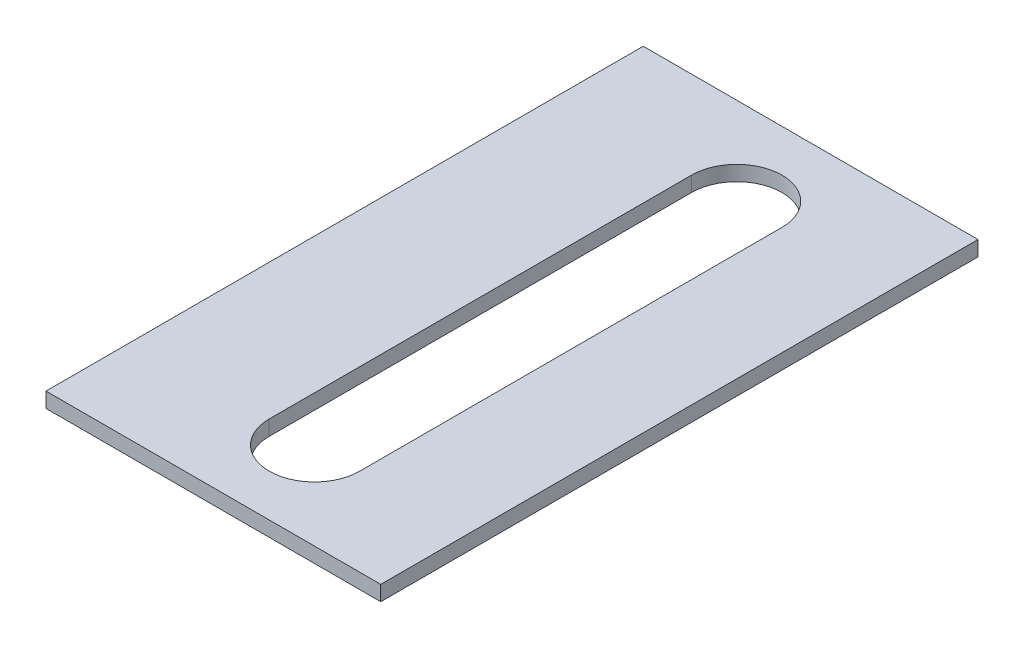
ISO-10303-21;
HEADER;
FILE_DESCRIPTION(('STEP AP214'),'2;1');
FILE_NAME('part.step','',(''),(''),'','','');
FILE_SCHEMA(('AUTOMOTIVE_DESIGN { 1 0 10303 214 1 1 1 1 }'));
ENDSEC;
DATA;
#1=APPLICATION_CONTEXT('core data for automotive mechanical design processes');
#2=APPLICATION_PROTOCOL_DEFINITION('international standard','automotive_design',2000,#1);
#3=PRODUCT_CONTEXT('',#1,'mechanical');
#4=PRODUCT('Part','Part','',(#3));
#5=PRODUCT_RELATED_PRODUCT_CATEGORY('part','',(#4));
#6=PRODUCT_DEFINITION_FORMATION('','',#4);
#7=PRODUCT_DEFINITION_CONTEXT('part definition',#1,'design');
#8=PRODUCT_DEFINITION('design','',#6,#7);
#9=PRODUCT_DEFINITION_SHAPE('','',#8);
#10=(LENGTH_UNIT() NAMED_UNIT(*) SI_UNIT(.MILLI.,.METRE.));
#11=(NAMED_UNIT(*) PLANE_ANGLE_UNIT() SI_UNIT($,.RADIAN.));
#12=(NAMED_UNIT(*) SI_UNIT($,.STERADIAN.) SOLID_ANGLE_UNIT());
#13=UNCERTAINTY_MEASURE_WITH_UNIT(LENGTH_MEASURE(1.E-05),#10,'distance_accuracy_value','');
#14=(GEOMETRIC_REPRESENTATION_CONTEXT(3) GLOBAL_UNCERTAINTY_ASSIGNED_CONTEXT((#13)) GLOBAL_UNIT_ASSIGNED_CONTEXT((#10,
#11,#12)) REPRESENTATION_CONTEXT('',''));
#15=CARTESIAN_POINT('',(0.,0.,0.));
#16=DIRECTION('',(0.,0.,1.));
#17=DIRECTION('',(1.,0.,0.));
#18=AXIS2_PLACEMENT_3D('',#15,#16,#17);
#19=CARTESIAN_POINT('',(-12.,8.4,6.9));
#20=DIRECTION('',(1.,0.,0.));
#21=DIRECTION('',(0.,0.,-1.));
#22=AXIS2_PLACEMENT_3D('',#19,#20,#21);
#23=PLANE('',#22);
#24=DIRECTION('',(0.,1.,0.));
#25=VECTOR('',#24,1.);
#26=CARTESIAN_POINT('',(-12.,8.4,-9.9));
#27=LINE('',#26,#25);
#28=CARTESIAN_POINT('',(-12.,7.9,-9.9));
#29=VERTEX_POINT('',#28);
#30=CARTESIAN_POINT('',(-12.,8.4,-9.9));
#31=VERTEX_POINT('',#30);
#32=EDGE_CURVE('E121',#29,#31,#27,.T.);
#33=ORIENTED_EDGE('',*,*,#32,.F.);
#34=DIRECTION('',(0.,0.,-1.));
#35=VECTOR('',#34,1.);
#36=CARTESIAN_POINT('',(-12.,7.9,-9.9));
#37=LINE('',#36,#35);
#38=CARTESIAN_POINT('',(-12.,7.9,9.9));
#39=VERTEX_POINT('',#38);
#40=EDGE_CURVE('E107',#39,#29,#37,.T.);
#41=ORIENTED_EDGE('',*,*,#40,.F.);
#42=DIRECTION('',(0.,-1.,0.));
#43=VECTOR('',#42,1.);
#44=CARTESIAN_POINT('',(-12.,8.4,9.9));
#45=LINE('',#44,#43);
#46=CARTESIAN_POINT('',(-12.,8.4,9.9));
#47=VERTEX_POINT('',#46);
#48=EDGE_CURVE('E137',#47,#39,#45,.T.);
#49=ORIENTED_EDGE('',*,*,#48,.F.);
#50=DIRECTION('',(0.,0.,1.));
#51=VECTOR('',#50,1.);
#52=CARTESIAN_POINT('',(-12.,8.4,6.9));
#53=LINE('',#52,#51);
#54=EDGE_CURVE('E128',#31,#47,#53,.T.);
#55=ORIENTED_EDGE('',*,*,#54,.F.);
#56=EDGE_LOOP('',(#33,#41,#49,#55));
#57=FACE_BOUND('',#56,.T.);
#58=ADVANCED_FACE('F44',(#57),#23,.F.);
#59=CARTESIAN_POINT('',(0.,8.4,0.));
#60=DIRECTION('',(0.,1.,0.));
#61=DIRECTION('',(0.,0.,1.));
#62=AXIS2_PLACEMENT_3D('',#59,#60,#61);
#63=PLANE('',#62);
#64=DIRECTION('',(0.,0.,1.));
#65=VECTOR('',#64,1.);
#66=CARTESIAN_POINT('',(-0.902865486843041,8.4,-26.1));
#67=LINE('',#66,#65);
#68=CARTESIAN_POINT('',(-0.902865486843041,8.4,-9.9));
#69=VERTEX_POINT('',#68);
#70=CARTESIAN_POINT('',(-0.902865486843041,8.4,9.9));
#71=VERTEX_POINT('',#70);
#72=EDGE_CURVE('E181',#69,#71,#67,.T.);
#73=ORIENTED_EDGE('',*,*,#72,.F.);
#74=DIRECTION('',(1.,0.,0.));
#75=VECTOR('',#74,1.);
#76=CARTESIAN_POINT('',(-12.,8.4,-9.9));
#77=LINE('',#76,#75);
#78=EDGE_CURVE('E131',#31,#69,#77,.T.);
#79=ORIENTED_EDGE('',*,*,#78,.F.);
#80=ORIENTED_EDGE('',*,*,#54,.T.);
#81=DIRECTION('',(-1.,0.,0.));
#82=VECTOR('',#81,1.);
#83=CARTESIAN_POINT('',(-12.,8.4,9.9));
#84=LINE('',#83,#82);
#85=EDGE_CURVE('E132',#71,#47,#84,.T.);
#86=ORIENTED_EDGE('',*,*,#85,.F.);
#87=EDGE_LOOP('',(#73,#79,#80,#86));
#88=FACE_BOUND('',#87,.T.);
#89=CARTESIAN_POINT('',(-6.,8.4,-7.));
#90=DIRECTION('',(0.,1.,0.));
#91=DIRECTION('',(0.,0.,1.));
#92=AXIS2_PLACEMENT_3D('',#89,#90,#91);
#93=CIRCLE('',#92,1.5);
#94=CARTESIAN_POINT('',(-4.5,8.4,-7.));
#95=VERTEX_POINT('',#94);
#96=CARTESIAN_POINT('',(-7.5,8.4,-7.));
#97=VERTEX_POINT('',#96);
#98=EDGE_CURVE('E11',#95,#97,#93,.T.);
#99=ORIENTED_EDGE('',*,*,#98,.F.);
#100=DIRECTION('',(0.,0.,-1.));
#101=VECTOR('',#100,1.);
#102=CARTESIAN_POINT('',(-4.5,8.4,0.));
#103=LINE('',#102,#101);
#104=CARTESIAN_POINT('',(-4.5,8.4,7.));
#105=VERTEX_POINT('',#104);
#106=EDGE_CURVE('E146',#105,#95,#103,.T.);
#107=ORIENTED_EDGE('',*,*,#106,.F.);
#108=CARTESIAN_POINT('',(-6.,8.4,7.));
#109=DIRECTION('',(0.,1.,0.));
#110=DIRECTION('',(0.,0.,1.));
#111=AXIS2_PLACEMENT_3D('',#108,#109,#110);
#112=CIRCLE('',#111,1.5);
#113=CARTESIAN_POINT('',(-7.5,8.4,7.));
#114=VERTEX_POINT('',#113);
#115=EDGE_CURVE('E52',#114,#105,#112,.T.);
#116=ORIENTED_EDGE('',*,*,#115,.F.);
#117=DIRECTION('',(0.,0.,1.));
#118=VECTOR('',#117,1.);
#119=CARTESIAN_POINT('',(-7.5,8.4,0.));
#120=LINE('',#119,#118);
#121=EDGE_CURVE('E143',#97,#114,#120,.T.);
#122=ORIENTED_EDGE('',*,*,#121,.F.);
#123=EDGE_LOOP('',(#99,#107,#116,#122));
#124=FACE_BOUND('',#123,.T.);
#125=ADVANCED_FACE('F163',(#88,#124),#63,.T.);
#126=CARTESIAN_POINT('',(0.,0.,-9.9));
#127=DIRECTION('',(0.,0.,1.));
#128=DIRECTION('',(1.,0.,0.));
#129=AXIS2_PLACEMENT_3D('',#126,#127,#128);
#130=PLANE('',#129);
#131=DIRECTION('',(0.,-1.,0.));
#132=VECTOR('',#131,1.);
#133=CARTESIAN_POINT('',(-0.902865486843041,0.,-9.9));
#134=LINE('',#133,#132);
#135=CARTESIAN_POINT('',(-0.902865486843041,7.9,-9.9));
#136=VERTEX_POINT('',#135);
#137=EDGE_CURVE('E123',#69,#136,#134,.T.);
#138=ORIENTED_EDGE('',*,*,#137,.T.);
#139=DIRECTION('',(1.,0.,0.));
#140=VECTOR('',#139,1.);
#141=CARTESIAN_POINT('',(-12.,7.9,-9.9));
#142=LINE('',#141,#140);
#143=EDGE_CURVE('E67',#29,#136,#142,.T.);
#144=ORIENTED_EDGE('',*,*,#143,.F.);
#145=ORIENTED_EDGE('',*,*,#32,.T.);
#146=ORIENTED_EDGE('',*,*,#78,.T.);
#147=EDGE_LOOP('',(#138,#144,#145,#146));
#148=FACE_BOUND('',#147,.T.);
#149=ADVANCED_FACE('F119',(#148),#130,.F.);
#150=CARTESIAN_POINT('',(0.,0.,9.9));
#151=DIRECTION('',(0.,0.,1.));
#152=DIRECTION('',(1.,0.,0.));
#153=AXIS2_PLACEMENT_3D('',#150,#151,#152);
#154=PLANE('',#153);
#155=DIRECTION('',(-1.,0.,0.));
#156=VECTOR('',#155,1.);
#157=CARTESIAN_POINT('',(0.,7.9,9.9));
#158=LINE('',#157,#156);
#159=CARTESIAN_POINT('',(-0.902865486843041,7.9,9.9));
#160=VERTEX_POINT('',#159);
#161=EDGE_CURVE('E110',#160,#39,#158,.T.);
#162=ORIENTED_EDGE('',*,*,#161,.F.);
#163=DIRECTION('',(0.,-1.,0.));
#164=VECTOR('',#163,1.);
#165=CARTESIAN_POINT('',(-0.902865486843041,8.4,9.9));
#166=LINE('',#165,#164);
#167=EDGE_CURVE('E184',#71,#160,#166,.T.);
#168=ORIENTED_EDGE('',*,*,#167,.F.);
#169=ORIENTED_EDGE('',*,*,#85,.T.);
#170=ORIENTED_EDGE('',*,*,#48,.T.);
#171=EDGE_LOOP('',(#162,#168,#169,#170));
#172=FACE_BOUND('',#171,.T.);
#173=ADVANCED_FACE('F206',(#172),#154,.T.);
#174=CARTESIAN_POINT('',(-6.,-30.6,-7.));
#175=DIRECTION('',(0.,1.,0.));
#176=DIRECTION('',(0.,0.,1.));
#177=AXIS2_PLACEMENT_3D('',#174,#175,#176);
#178=CYLINDRICAL_SURFACE('',#177,1.5);
#179=DIRECTION('',(0.,1.,0.));
#180=VECTOR('',#179,1.);
#181=CARTESIAN_POINT('',(-7.5,-30.6,-7.));
#182=LINE('',#181,#180);
#183=CARTESIAN_POINT('',(-7.5,7.9,-7.));
#184=VERTEX_POINT('',#183);
#185=EDGE_CURVE('E172',#184,#97,#182,.T.);
#186=ORIENTED_EDGE('',*,*,#185,.F.);
#187=CARTESIAN_POINT('',(-6.,7.9,-7.));
#188=DIRECTION('',(0.,1.,0.));
#189=DIRECTION('',(0.,0.,1.));
#190=AXIS2_PLACEMENT_3D('',#187,#188,#189);
#191=CIRCLE('',#190,1.5);
#192=CARTESIAN_POINT('',(-4.5,7.9,-7.));
#193=VERTEX_POINT('',#192);
#194=EDGE_CURVE('E59',#184,#193,#191,.F.);
#195=ORIENTED_EDGE('',*,*,#194,.T.);
#196=DIRECTION('',(0.,1.,0.));
#197=VECTOR('',#196,1.);
#198=CARTESIAN_POINT('',(-4.5,-30.6,-7.));
#199=LINE('',#198,#197);
#200=EDGE_CURVE('E147',#193,#95,#199,.T.);
#201=ORIENTED_EDGE('',*,*,#200,.T.);
#202=ORIENTED_EDGE('',*,*,#98,.T.);
#203=EDGE_LOOP('',(#186,#195,#201,#202));
#204=FACE_BOUND('',#203,.T.);
#205=ADVANCED_FACE('F220',(#204),#178,.F.);
#206=CARTESIAN_POINT('',(-6.,-30.6,7.));
#207=DIRECTION('',(0.,1.,0.));
#208=DIRECTION('',(0.,0.,1.));
#209=AXIS2_PLACEMENT_3D('',#206,#207,#208);
#210=CYLINDRICAL_SURFACE('',#209,1.5);
#211=DIRECTION('',(0.,1.,0.));
#212=VECTOR('',#211,1.);
#213=CARTESIAN_POINT('',(-4.5,-30.6,7.));
#214=LINE('',#213,#212);
#215=CARTESIAN_POINT('',(-4.5,7.9,7.));
#216=VERTEX_POINT('',#215);
#217=EDGE_CURVE('E156',#216,#105,#214,.T.);
#218=ORIENTED_EDGE('',*,*,#217,.F.);
#219=CARTESIAN_POINT('',(-6.,7.9,7.));
#220=DIRECTION('',(0.,1.,0.));
#221=DIRECTION('',(0.,0.,1.));
#222=AXIS2_PLACEMENT_3D('',#219,#220,#221);
#223=CIRCLE('',#222,1.5);
#224=CARTESIAN_POINT('',(-7.5,7.9,7.));
#225=VERTEX_POINT('',#224);
#226=EDGE_CURVE('E196',#216,#225,#223,.F.);
#227=ORIENTED_EDGE('',*,*,#226,.T.);
#228=DIRECTION('',(0.,1.,0.));
#229=VECTOR('',#228,1.);
#230=CARTESIAN_POINT('',(-7.5,-30.6,7.));
#231=LINE('',#230,#229);
#232=EDGE_CURVE('E158',#225,#114,#231,.T.);
#233=ORIENTED_EDGE('',*,*,#232,.T.);
#234=ORIENTED_EDGE('',*,*,#115,.T.);
#235=EDGE_LOOP('',(#218,#227,#233,#234));
#236=FACE_BOUND('',#235,.T.);
#237=ADVANCED_FACE('F154',(#236),#210,.F.);
#238=CARTESIAN_POINT('',(-4.5,-30.6,-7.));
#239=DIRECTION('',(1.,0.,0.));
#240=DIRECTION('',(0.,0.,-1.));
#241=AXIS2_PLACEMENT_3D('',#238,#239,#240);
#242=PLANE('',#241);
#243=ORIENTED_EDGE('',*,*,#200,.F.);
#244=DIRECTION('',(0.,0.,1.));
#245=VECTOR('',#244,1.);
#246=CARTESIAN_POINT('',(-4.5,7.9,-7.));
#247=LINE('',#246,#245);
#248=EDGE_CURVE('E190',#193,#216,#247,.T.);
#249=ORIENTED_EDGE('',*,*,#248,.T.);
#250=ORIENTED_EDGE('',*,*,#217,.T.);
#251=ORIENTED_EDGE('',*,*,#106,.T.);
#252=EDGE_LOOP('',(#243,#249,#250,#251));
#253=FACE_BOUND('',#252,.T.);
#254=ADVANCED_FACE('F227',(#253),#242,.F.);
#255=CARTESIAN_POINT('',(-7.5,-30.6,-7.));
#256=DIRECTION('',(-1.,0.,0.));
#257=DIRECTION('',(0.,0.,1.));
#258=AXIS2_PLACEMENT_3D('',#255,#256,#257);
#259=PLANE('',#258);
#260=ORIENTED_EDGE('',*,*,#232,.F.);
#261=DIRECTION('',(0.,0.,-1.));
#262=VECTOR('',#261,1.);
#263=CARTESIAN_POINT('',(-7.5,7.9,-7.));
#264=LINE('',#263,#262);
#265=EDGE_CURVE('E199',#225,#184,#264,.T.);
#266=ORIENTED_EDGE('',*,*,#265,.T.);
#267=ORIENTED_EDGE('',*,*,#185,.T.);
#268=ORIENTED_EDGE('',*,*,#121,.T.);
#269=EDGE_LOOP('',(#260,#266,#267,#268));
#270=FACE_BOUND('',#269,.T.);
#271=ADVANCED_FACE('F224',(#270),#259,.F.);
#272=CARTESIAN_POINT('',(-0.902865486843041,8.4,-26.1));
#273=DIRECTION('',(-1.,0.,0.));
#274=DIRECTION('',(0.,0.,1.));
#275=AXIS2_PLACEMENT_3D('',#272,#273,#274);
#276=PLANE('',#275);
#277=ORIENTED_EDGE('',*,*,#167,.T.);
#278=DIRECTION('',(0.,0.,1.));
#279=VECTOR('',#278,1.);
#280=CARTESIAN_POINT('',(-0.902865486843041,7.9,-9.9));
#281=LINE('',#280,#279);
#282=EDGE_CURVE('E125',#136,#160,#281,.T.);
#283=ORIENTED_EDGE('',*,*,#282,.F.);
#284=ORIENTED_EDGE('',*,*,#137,.F.);
#285=ORIENTED_EDGE('',*,*,#72,.T.);
#286=EDGE_LOOP('',(#277,#283,#284,#285));
#287=FACE_BOUND('',#286,.T.);
#288=ADVANCED_FACE('F208',(#287),#276,.F.);
#289=CARTESIAN_POINT('',(0.,7.9,0.));
#290=DIRECTION('',(0.,1.,0.));
#291=DIRECTION('',(0.,0.,1.));
#292=AXIS2_PLACEMENT_3D('',#289,#290,#291);
#293=PLANE('',#292);
#294=ORIENTED_EDGE('',*,*,#161,.T.);
#295=ORIENTED_EDGE('',*,*,#40,.T.);
#296=ORIENTED_EDGE('',*,*,#143,.T.);
#297=ORIENTED_EDGE('',*,*,#282,.T.);
#298=EDGE_LOOP('',(#294,#295,#296,#297));
#299=FACE_BOUND('',#298,.T.);
#300=ORIENTED_EDGE('',*,*,#194,.F.);
#301=ORIENTED_EDGE('',*,*,#265,.F.);
#302=ORIENTED_EDGE('',*,*,#226,.F.);
#303=ORIENTED_EDGE('',*,*,#248,.F.);
#304=EDGE_LOOP('',(#300,#301,#302,#303));
#305=FACE_BOUND('',#304,.T.);
#306=ADVANCED_FACE('F108',(#299,#305),#293,.F.);
#307=CLOSED_SHELL('',(#58,#125,#149,#173,#205,#237,#254,#271,#288,#306));
#308=MANIFOLD_SOLID_BREP('B2',#307);
#309=ADVANCED_BREP_SHAPE_REPRESENTATION('',(#18,#308),#14);
#310=SHAPE_DEFINITION_REPRESENTATION(#9,#309);
ENDSEC;
END-ISO-10303-21;
